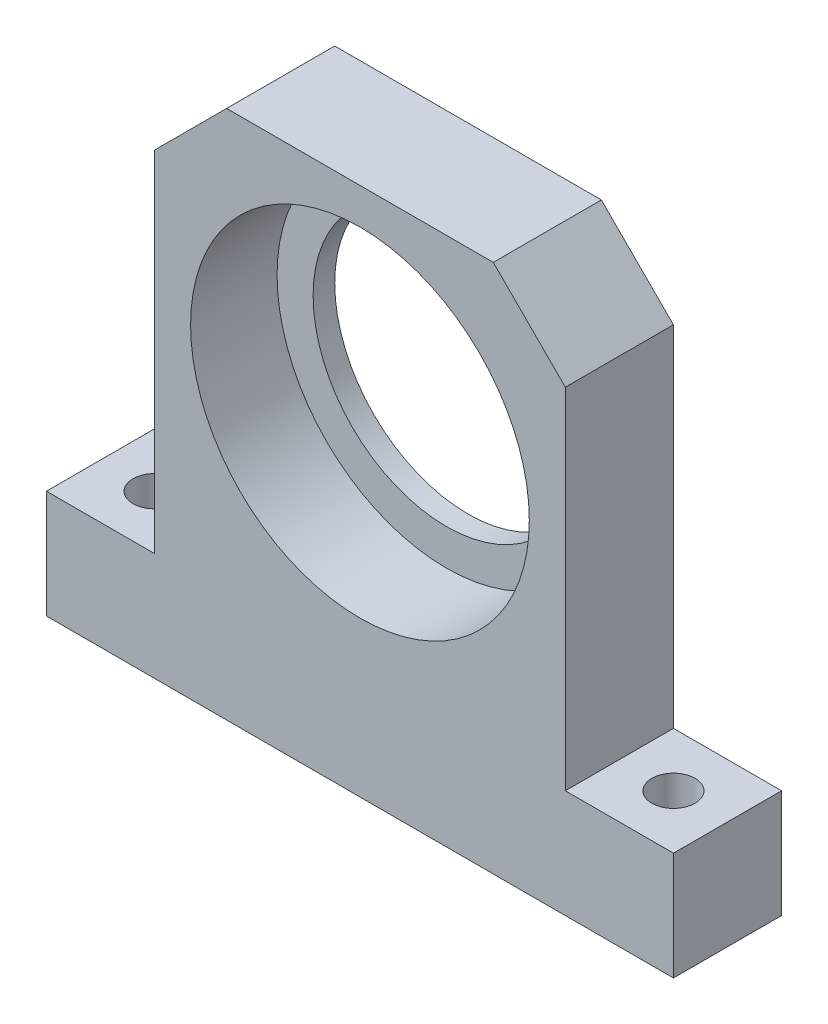
ISO-10303-21;
HEADER;
FILE_DESCRIPTION(('STEP AP214'),'2;1');
FILE_NAME('part.step','',(''),(''),'','','');
FILE_SCHEMA(('AUTOMOTIVE_DESIGN { 1 0 10303 214 1 1 1 1 }'));
ENDSEC;
DATA;
#1=APPLICATION_CONTEXT('core data for automotive mechanical design processes');
#2=APPLICATION_PROTOCOL_DEFINITION('international standard','automotive_design',2000,#1);
#3=PRODUCT_CONTEXT('',#1,'mechanical');
#4=PRODUCT('Part','Part','',(#3));
#5=PRODUCT_RELATED_PRODUCT_CATEGORY('part','',(#4));
#6=PRODUCT_DEFINITION_FORMATION('','',#4);
#7=PRODUCT_DEFINITION_CONTEXT('part definition',#1,'design');
#8=PRODUCT_DEFINITION('design','',#6,#7);
#9=PRODUCT_DEFINITION_SHAPE('','',#8);
#10=(LENGTH_UNIT() NAMED_UNIT(*) SI_UNIT(.MILLI.,.METRE.));
#11=(NAMED_UNIT(*) PLANE_ANGLE_UNIT() SI_UNIT($,.RADIAN.));
#12=(NAMED_UNIT(*) SI_UNIT($,.STERADIAN.) SOLID_ANGLE_UNIT());
#13=UNCERTAINTY_MEASURE_WITH_UNIT(LENGTH_MEASURE(1.E-05),#10,'distance_accuracy_value','');
#14=(GEOMETRIC_REPRESENTATION_CONTEXT(3) GLOBAL_UNCERTAINTY_ASSIGNED_CONTEXT((#13)) GLOBAL_UNIT_ASSIGNED_CONTEXT((#10,
#11,#12)) REPRESENTATION_CONTEXT('',''));
#15=CARTESIAN_POINT('',(0.,0.,0.));
#16=DIRECTION('',(0.,0.,1.));
#17=DIRECTION('',(1.,0.,0.));
#18=AXIS2_PLACEMENT_3D('',#15,#16,#17);
#19=CARTESIAN_POINT('',(0.,-45.,15.));
#20=DIRECTION('',(0.,1.,0.));
#21=DIRECTION('',(0.,0.,1.));
#22=AXIS2_PLACEMENT_3D('',#19,#20,#21);
#23=PLANE('',#22);
#24=CARTESIAN_POINT('',(-36.,-45.,7.5));
#25=DIRECTION('',(0.,1.,0.));
#26=DIRECTION('',(-1.,0.,0.));
#27=AXIS2_PLACEMENT_3D('',#24,#25,#26);
#28=CIRCLE('',#27,3.);
#29=CARTESIAN_POINT('',(-39.,-45.,7.5));
#30=VERTEX_POINT('',#29);
#31=EDGE_CURVE('E268',#30,#30,#28,.T.);
#32=ORIENTED_EDGE('',*,*,#31,.T.);
#33=EDGE_LOOP('',(#32));
#34=FACE_BOUND('',#33,.T.);
#35=DIRECTION('',(1.,0.,0.));
#36=VECTOR('',#35,1.);
#37=CARTESIAN_POINT('',(0.,-45.,0.));
#38=LINE('',#37,#36);
#39=CARTESIAN_POINT('',(-43.5,-45.,0.));
#40=VERTEX_POINT('',#39);
#41=CARTESIAN_POINT('',(43.5,-45.,0.));
#42=VERTEX_POINT('',#41);
#43=EDGE_CURVE('E136',#40,#42,#38,.T.);
#44=ORIENTED_EDGE('',*,*,#43,.T.);
#45=DIRECTION('',(0.,0.,-1.));
#46=VECTOR('',#45,1.);
#47=CARTESIAN_POINT('',(43.5,-45.,15.));
#48=LINE('',#47,#46);
#49=CARTESIAN_POINT('',(43.5,-45.,15.));
#50=VERTEX_POINT('',#49);
#51=EDGE_CURVE('E133',#50,#42,#48,.T.);
#52=ORIENTED_EDGE('',*,*,#51,.F.);
#53=DIRECTION('',(1.,0.,0.));
#54=VECTOR('',#53,1.);
#55=CARTESIAN_POINT('',(0.,-45.,15.));
#56=LINE('',#55,#54);
#57=CARTESIAN_POINT('',(-43.5,-45.,15.));
#58=VERTEX_POINT('',#57);
#59=EDGE_CURVE('E122',#58,#50,#56,.T.);
#60=ORIENTED_EDGE('',*,*,#59,.F.);
#61=DIRECTION('',(0.,0.,-1.));
#62=VECTOR('',#61,1.);
#63=CARTESIAN_POINT('',(-43.5,-45.,15.));
#64=LINE('',#63,#62);
#65=EDGE_CURVE('E137',#58,#40,#64,.T.);
#66=ORIENTED_EDGE('',*,*,#65,.T.);
#67=EDGE_LOOP('',(#44,#52,#60,#66));
#68=FACE_BOUND('',#67,.T.);
#69=CARTESIAN_POINT('',(36.,-45.,7.5));
#70=DIRECTION('',(0.,-1.,0.));
#71=DIRECTION('',(1.,0.,0.));
#72=AXIS2_PLACEMENT_3D('',#69,#70,#71);
#73=CIRCLE('',#72,3.);
#74=CARTESIAN_POINT('',(33.,-45.,7.5));
#75=VERTEX_POINT('',#74);
#76=EDGE_CURVE('E274',#75,#75,#73,.T.);
#77=ORIENTED_EDGE('',*,*,#76,.F.);
#78=EDGE_LOOP('',(#77));
#79=FACE_BOUND('',#78,.T.);
#80=ADVANCED_FACE('F36',(#34,#68,#79),#23,.F.);
#81=CARTESIAN_POINT('',(0.,-30.,15.));
#82=DIRECTION('',(0.,-1.,0.));
#83=DIRECTION('',(1.,0.,0.));
#84=AXIS2_PLACEMENT_3D('',#81,#82,#83);
#85=PLANE('',#84);
#86=DIRECTION('',(-1.,0.,0.));
#87=VECTOR('',#86,1.);
#88=CARTESIAN_POINT('',(0.,-30.,0.));
#89=LINE('',#88,#87);
#90=CARTESIAN_POINT('',(43.5,-30.,0.));
#91=VERTEX_POINT('',#90);
#92=CARTESIAN_POINT('',(28.5,-30.,0.));
#93=VERTEX_POINT('',#92);
#94=EDGE_CURVE('E94',#91,#93,#89,.T.);
#95=ORIENTED_EDGE('',*,*,#94,.T.);
#96=DIRECTION('',(0.,0.,-1.));
#97=VECTOR('',#96,1.);
#98=CARTESIAN_POINT('',(28.5,-30.,15.));
#99=LINE('',#98,#97);
#100=CARTESIAN_POINT('',(28.5,-30.,15.));
#101=VERTEX_POINT('',#100);
#102=EDGE_CURVE('E142',#101,#93,#99,.T.);
#103=ORIENTED_EDGE('',*,*,#102,.F.);
#104=DIRECTION('',(-1.,0.,0.));
#105=VECTOR('',#104,1.);
#106=CARTESIAN_POINT('',(0.,-30.,15.));
#107=LINE('',#106,#105);
#108=CARTESIAN_POINT('',(43.5,-30.,15.));
#109=VERTEX_POINT('',#108);
#110=EDGE_CURVE('E53',#109,#101,#107,.T.);
#111=ORIENTED_EDGE('',*,*,#110,.F.);
#112=DIRECTION('',(0.,0.,-1.));
#113=VECTOR('',#112,1.);
#114=CARTESIAN_POINT('',(43.5,-30.,15.));
#115=LINE('',#114,#113);
#116=EDGE_CURVE('E138',#109,#91,#115,.T.);
#117=ORIENTED_EDGE('',*,*,#116,.T.);
#118=EDGE_LOOP('',(#95,#103,#111,#117));
#119=FACE_BOUND('',#118,.T.);
#120=CARTESIAN_POINT('',(36.,-30.,7.5));
#121=DIRECTION('',(0.,-1.,0.));
#122=DIRECTION('',(1.,0.,0.));
#123=AXIS2_PLACEMENT_3D('',#120,#121,#122);
#124=CIRCLE('',#123,3.);
#125=CARTESIAN_POINT('',(33.,-30.,7.5));
#126=VERTEX_POINT('',#125);
#127=EDGE_CURVE('E276',#126,#126,#124,.T.);
#128=ORIENTED_EDGE('',*,*,#127,.T.);
#129=EDGE_LOOP('',(#128));
#130=FACE_BOUND('',#129,.T.);
#131=ADVANCED_FACE('F234',(#119,#130),#85,.F.);
#132=CARTESIAN_POINT('',(28.5,0.,15.));
#133=DIRECTION('',(-1.,0.,0.));
#134=DIRECTION('',(0.,0.,1.));
#135=AXIS2_PLACEMENT_3D('',#132,#133,#134);
#136=PLANE('',#135);
#137=DIRECTION('',(0.,1.,0.));
#138=VECTOR('',#137,1.);
#139=CARTESIAN_POINT('',(28.5,0.,0.));
#140=LINE('',#139,#138);
#141=CARTESIAN_POINT('',(28.5,18.5,0.));
#142=VERTEX_POINT('',#141);
#143=EDGE_CURVE('E146',#93,#142,#140,.T.);
#144=ORIENTED_EDGE('',*,*,#143,.T.);
#145=DIRECTION('',(0.,0.,-1.));
#146=VECTOR('',#145,1.);
#147=CARTESIAN_POINT('',(28.5,18.5,15.));
#148=LINE('',#147,#146);
#149=CARTESIAN_POINT('',(28.5,18.5,15.));
#150=VERTEX_POINT('',#149);
#151=EDGE_CURVE('E45',#150,#142,#148,.T.);
#152=ORIENTED_EDGE('',*,*,#151,.F.);
#153=DIRECTION('',(0.,1.,0.));
#154=VECTOR('',#153,1.);
#155=CARTESIAN_POINT('',(28.5,0.,15.));
#156=LINE('',#155,#154);
#157=EDGE_CURVE('E261',#101,#150,#156,.T.);
#158=ORIENTED_EDGE('',*,*,#157,.F.);
#159=ORIENTED_EDGE('',*,*,#102,.T.);
#160=EDGE_LOOP('',(#144,#152,#158,#159));
#161=FACE_BOUND('',#160,.T.);
#162=ADVANCED_FACE('F188',(#161),#136,.F.);
#163=CARTESIAN_POINT('',(23.5,23.5,15.));
#164=DIRECTION('',(-0.707106781186547,-0.707106781186548,0.));
#165=DIRECTION('',(0.707106781186548,-0.707106781186547,0.));
#166=AXIS2_PLACEMENT_3D('',#163,#164,#165);
#167=PLANE('',#166);
#168=DIRECTION('',(-0.707106781186548,0.707106781186547,0.));
#169=VECTOR('',#168,1.);
#170=CARTESIAN_POINT('',(23.5,23.5,0.));
#171=LINE('',#170,#169);
#172=CARTESIAN_POINT('',(18.5,28.5,0.));
#173=VERTEX_POINT('',#172);
#174=EDGE_CURVE('E149',#142,#173,#171,.T.);
#175=ORIENTED_EDGE('',*,*,#174,.T.);
#176=DIRECTION('',(0.,0.,-1.));
#177=VECTOR('',#176,1.);
#178=CARTESIAN_POINT('',(18.5,28.5,15.));
#179=LINE('',#178,#177);
#180=CARTESIAN_POINT('',(18.5,28.5,15.));
#181=VERTEX_POINT('',#180);
#182=EDGE_CURVE('E181',#181,#173,#179,.T.);
#183=ORIENTED_EDGE('',*,*,#182,.F.);
#184=DIRECTION('',(-0.707106781186548,0.707106781186547,0.));
#185=VECTOR('',#184,1.);
#186=CARTESIAN_POINT('',(23.5,23.5,15.));
#187=LINE('',#186,#185);
#188=EDGE_CURVE('E103',#150,#181,#187,.T.);
#189=ORIENTED_EDGE('',*,*,#188,.F.);
#190=ORIENTED_EDGE('',*,*,#151,.T.);
#191=EDGE_LOOP('',(#175,#183,#189,#190));
#192=FACE_BOUND('',#191,.T.);
#193=ADVANCED_FACE('F184',(#192),#167,.F.);
#194=CARTESIAN_POINT('',(0.,28.5,15.));
#195=DIRECTION('',(0.,-1.,0.));
#196=DIRECTION('',(1.,0.,0.));
#197=AXIS2_PLACEMENT_3D('',#194,#195,#196);
#198=PLANE('',#197);
#199=DIRECTION('',(-1.,0.,0.));
#200=VECTOR('',#199,1.);
#201=CARTESIAN_POINT('',(0.,28.5,0.));
#202=LINE('',#201,#200);
#203=CARTESIAN_POINT('',(-18.5,28.5,0.));
#204=VERTEX_POINT('',#203);
#205=EDGE_CURVE('E152',#173,#204,#202,.T.);
#206=ORIENTED_EDGE('',*,*,#205,.T.);
#207=DIRECTION('',(0.,0.,-1.));
#208=VECTOR('',#207,1.);
#209=CARTESIAN_POINT('',(-18.5,28.5,15.));
#210=LINE('',#209,#208);
#211=CARTESIAN_POINT('',(-18.5,28.5,15.));
#212=VERTEX_POINT('',#211);
#213=EDGE_CURVE('E178',#212,#204,#210,.T.);
#214=ORIENTED_EDGE('',*,*,#213,.F.);
#215=DIRECTION('',(-1.,0.,0.));
#216=VECTOR('',#215,1.);
#217=CARTESIAN_POINT('',(0.,28.5,15.));
#218=LINE('',#217,#216);
#219=EDGE_CURVE('E206',#181,#212,#218,.T.);
#220=ORIENTED_EDGE('',*,*,#219,.F.);
#221=ORIENTED_EDGE('',*,*,#182,.T.);
#222=EDGE_LOOP('',(#206,#214,#220,#221));
#223=FACE_BOUND('',#222,.T.);
#224=ADVANCED_FACE('F197',(#223),#198,.F.);
#225=CARTESIAN_POINT('',(-23.5,23.5,15.));
#226=DIRECTION('',(0.707106781186547,-0.707106781186548,0.));
#227=DIRECTION('',(0.707106781186548,0.707106781186547,0.));
#228=AXIS2_PLACEMENT_3D('',#225,#226,#227);
#229=PLANE('',#228);
#230=DIRECTION('',(-0.707106781186548,-0.707106781186547,0.));
#231=VECTOR('',#230,1.);
#232=CARTESIAN_POINT('',(-23.5,23.5,0.));
#233=LINE('',#232,#231);
#234=CARTESIAN_POINT('',(-28.5,18.5,0.));
#235=VERTEX_POINT('',#234);
#236=EDGE_CURVE('E154',#204,#235,#233,.T.);
#237=ORIENTED_EDGE('',*,*,#236,.T.);
#238=DIRECTION('',(0.,0.,-1.));
#239=VECTOR('',#238,1.);
#240=CARTESIAN_POINT('',(-28.5,18.5,15.));
#241=LINE('',#240,#239);
#242=CARTESIAN_POINT('',(-28.5,18.5,15.));
#243=VERTEX_POINT('',#242);
#244=EDGE_CURVE('E175',#243,#235,#241,.T.);
#245=ORIENTED_EDGE('',*,*,#244,.F.);
#246=DIRECTION('',(-0.707106781186548,-0.707106781186547,0.));
#247=VECTOR('',#246,1.);
#248=CARTESIAN_POINT('',(-23.5,23.5,15.));
#249=LINE('',#248,#247);
#250=EDGE_CURVE('E203',#212,#243,#249,.T.);
#251=ORIENTED_EDGE('',*,*,#250,.F.);
#252=ORIENTED_EDGE('',*,*,#213,.T.);
#253=EDGE_LOOP('',(#237,#245,#251,#252));
#254=FACE_BOUND('',#253,.T.);
#255=ADVANCED_FACE('F201',(#254),#229,.F.);
#256=CARTESIAN_POINT('',(-28.5,0.,15.));
#257=DIRECTION('',(1.,0.,0.));
#258=DIRECTION('',(0.,1.,0.));
#259=AXIS2_PLACEMENT_3D('',#256,#257,#258);
#260=PLANE('',#259);
#261=DIRECTION('',(0.,-1.,0.));
#262=VECTOR('',#261,1.);
#263=CARTESIAN_POINT('',(-28.5,0.,0.));
#264=LINE('',#263,#262);
#265=CARTESIAN_POINT('',(-28.5,-30.,0.));
#266=VERTEX_POINT('',#265);
#267=EDGE_CURVE('E156',#235,#266,#264,.T.);
#268=ORIENTED_EDGE('',*,*,#267,.T.);
#269=DIRECTION('',(0.,0.,-1.));
#270=VECTOR('',#269,1.);
#271=CARTESIAN_POINT('',(-28.5,-30.,15.));
#272=LINE('',#271,#270);
#273=CARTESIAN_POINT('',(-28.5,-30.,15.));
#274=VERTEX_POINT('',#273);
#275=EDGE_CURVE('E172',#274,#266,#272,.T.);
#276=ORIENTED_EDGE('',*,*,#275,.F.);
#277=DIRECTION('',(0.,-1.,0.));
#278=VECTOR('',#277,1.);
#279=CARTESIAN_POINT('',(-28.5,0.,15.));
#280=LINE('',#279,#278);
#281=EDGE_CURVE('E205',#243,#274,#280,.T.);
#282=ORIENTED_EDGE('',*,*,#281,.F.);
#283=ORIENTED_EDGE('',*,*,#244,.T.);
#284=EDGE_LOOP('',(#268,#276,#282,#283));
#285=FACE_BOUND('',#284,.T.);
#286=ADVANCED_FACE('F223',(#285),#260,.F.);
#287=CARTESIAN_POINT('',(0.,-30.,15.));
#288=DIRECTION('',(0.,-1.,0.));
#289=DIRECTION('',(1.,0.,0.));
#290=AXIS2_PLACEMENT_3D('',#287,#288,#289);
#291=PLANE('',#290);
#292=CARTESIAN_POINT('',(-36.,-30.,7.5));
#293=DIRECTION('',(0.,1.,0.));
#294=DIRECTION('',(-1.,0.,0.));
#295=AXIS2_PLACEMENT_3D('',#292,#293,#294);
#296=CIRCLE('',#295,3.);
#297=CARTESIAN_POINT('',(-39.,-30.,7.5));
#298=VERTEX_POINT('',#297);
#299=EDGE_CURVE('E271',#298,#298,#296,.T.);
#300=ORIENTED_EDGE('',*,*,#299,.F.);
#301=EDGE_LOOP('',(#300));
#302=FACE_BOUND('',#301,.T.);
#303=DIRECTION('',(-1.,0.,0.));
#304=VECTOR('',#303,1.);
#305=CARTESIAN_POINT('',(0.,-30.,0.));
#306=LINE('',#305,#304);
#307=CARTESIAN_POINT('',(-43.5,-30.,0.));
#308=VERTEX_POINT('',#307);
#309=EDGE_CURVE('E158',#266,#308,#306,.T.);
#310=ORIENTED_EDGE('',*,*,#309,.T.);
#311=DIRECTION('',(0.,0.,-1.));
#312=VECTOR('',#311,1.);
#313=CARTESIAN_POINT('',(-43.5,-30.,15.));
#314=LINE('',#313,#312);
#315=CARTESIAN_POINT('',(-43.5,-30.,15.));
#316=VERTEX_POINT('',#315);
#317=EDGE_CURVE('E169',#316,#308,#314,.T.);
#318=ORIENTED_EDGE('',*,*,#317,.F.);
#319=DIRECTION('',(-1.,0.,0.));
#320=VECTOR('',#319,1.);
#321=CARTESIAN_POINT('',(0.,-30.,15.));
#322=LINE('',#321,#320);
#323=EDGE_CURVE('E208',#274,#316,#322,.T.);
#324=ORIENTED_EDGE('',*,*,#323,.F.);
#325=ORIENTED_EDGE('',*,*,#275,.T.);
#326=EDGE_LOOP('',(#310,#318,#324,#325));
#327=FACE_BOUND('',#326,.T.);
#328=ADVANCED_FACE('F217',(#302,#327),#291,.F.);
#329=CARTESIAN_POINT('',(-43.5,0.,15.));
#330=DIRECTION('',(1.,0.,0.));
#331=DIRECTION('',(0.,0.,-1.));
#332=AXIS2_PLACEMENT_3D('',#329,#330,#331);
#333=PLANE('',#332);
#334=DIRECTION('',(0.,-1.,0.));
#335=VECTOR('',#334,1.);
#336=CARTESIAN_POINT('',(-43.5,0.,0.));
#337=LINE('',#336,#335);
#338=EDGE_CURVE('E160',#308,#40,#337,.T.);
#339=ORIENTED_EDGE('',*,*,#338,.T.);
#340=ORIENTED_EDGE('',*,*,#65,.F.);
#341=DIRECTION('',(0.,-1.,0.));
#342=VECTOR('',#341,1.);
#343=CARTESIAN_POINT('',(-43.5,0.,15.));
#344=LINE('',#343,#342);
#345=EDGE_CURVE('E128',#316,#58,#344,.T.);
#346=ORIENTED_EDGE('',*,*,#345,.F.);
#347=ORIENTED_EDGE('',*,*,#317,.T.);
#348=EDGE_LOOP('',(#339,#340,#346,#347));
#349=FACE_BOUND('',#348,.T.);
#350=ADVANCED_FACE('F221',(#349),#333,.F.);
#351=CARTESIAN_POINT('',(43.5,0.,15.));
#352=DIRECTION('',(-1.,0.,0.));
#353=DIRECTION('',(0.,0.,1.));
#354=AXIS2_PLACEMENT_3D('',#351,#352,#353);
#355=PLANE('',#354);
#356=DIRECTION('',(0.,1.,0.));
#357=VECTOR('',#356,1.);
#358=CARTESIAN_POINT('',(43.5,0.,0.));
#359=LINE('',#358,#357);
#360=EDGE_CURVE('E88',#42,#91,#359,.T.);
#361=ORIENTED_EDGE('',*,*,#360,.T.);
#362=ORIENTED_EDGE('',*,*,#116,.F.);
#363=DIRECTION('',(0.,1.,0.));
#364=VECTOR('',#363,1.);
#365=CARTESIAN_POINT('',(43.5,0.,15.));
#366=LINE('',#365,#364);
#367=EDGE_CURVE('E126',#50,#109,#366,.T.);
#368=ORIENTED_EDGE('',*,*,#367,.F.);
#369=ORIENTED_EDGE('',*,*,#51,.T.);
#370=EDGE_LOOP('',(#361,#362,#368,#369));
#371=FACE_BOUND('',#370,.T.);
#372=ADVANCED_FACE('F140',(#371),#355,.F.);
#373=CARTESIAN_POINT('',(0.,0.,15.));
#374=DIRECTION('',(0.,0.,-1.));
#375=DIRECTION('',(-1.,0.,0.));
#376=AXIS2_PLACEMENT_3D('',#373,#374,#375);
#377=CYLINDRICAL_SURFACE('',#376,23.5);
#378=CARTESIAN_POINT('',(0.,0.,3.));
#379=DIRECTION('',(0.,0.,1.));
#380=DIRECTION('',(1.,0.,0.));
#381=AXIS2_PLACEMENT_3D('',#378,#379,#380);
#382=CIRCLE('',#381,23.5);
#383=CARTESIAN_POINT('',(23.5,0.,3.));
#384=VERTEX_POINT('',#383);
#385=EDGE_CURVE('E11',#384,#384,#382,.T.);
#386=ORIENTED_EDGE('',*,*,#385,.F.);
#387=EDGE_LOOP('',(#386));
#388=FACE_BOUND('',#387,.T.);
#389=CARTESIAN_POINT('',(0.,0.,15.));
#390=DIRECTION('',(0.,0.,1.));
#391=DIRECTION('',(1.,0.,0.));
#392=AXIS2_PLACEMENT_3D('',#389,#390,#391);
#393=CIRCLE('',#392,23.5);
#394=CARTESIAN_POINT('',(23.5,0.,15.));
#395=VERTEX_POINT('',#394);
#396=EDGE_CURVE('E165',#395,#395,#393,.T.);
#397=ORIENTED_EDGE('',*,*,#396,.T.);
#398=EDGE_LOOP('',(#397));
#399=FACE_BOUND('',#398,.T.);
#400=ADVANCED_FACE('F38',(#388,#399),#377,.F.);
#401=CARTESIAN_POINT('',(0.,0.,15.));
#402=DIRECTION('',(0.,0.,1.));
#403=DIRECTION('',(1.,0.,0.));
#404=AXIS2_PLACEMENT_3D('',#401,#402,#403);
#405=PLANE('',#404);
#406=ORIENTED_EDGE('',*,*,#396,.F.);
#407=EDGE_LOOP('',(#406));
#408=FACE_BOUND('',#407,.T.);
#409=ORIENTED_EDGE('',*,*,#157,.T.);
#410=ORIENTED_EDGE('',*,*,#188,.T.);
#411=ORIENTED_EDGE('',*,*,#219,.T.);
#412=ORIENTED_EDGE('',*,*,#250,.T.);
#413=ORIENTED_EDGE('',*,*,#281,.T.);
#414=ORIENTED_EDGE('',*,*,#323,.T.);
#415=ORIENTED_EDGE('',*,*,#345,.T.);
#416=ORIENTED_EDGE('',*,*,#59,.T.);
#417=ORIENTED_EDGE('',*,*,#367,.T.);
#418=ORIENTED_EDGE('',*,*,#110,.T.);
#419=EDGE_LOOP('',(#409,#410,#411,#412,#413,#414,#415,#416,#417,#418));
#420=FACE_BOUND('',#419,.T.);
#421=ADVANCED_FACE('F124',(#408,#420),#405,.T.);
#422=CARTESIAN_POINT('',(0.,0.,0.));
#423=DIRECTION('',(0.,0.,1.));
#424=DIRECTION('',(1.,0.,0.));
#425=AXIS2_PLACEMENT_3D('',#422,#423,#424);
#426=PLANE('',#425);
#427=ORIENTED_EDGE('',*,*,#143,.F.);
#428=ORIENTED_EDGE('',*,*,#94,.F.);
#429=ORIENTED_EDGE('',*,*,#360,.F.);
#430=ORIENTED_EDGE('',*,*,#43,.F.);
#431=ORIENTED_EDGE('',*,*,#338,.F.);
#432=ORIENTED_EDGE('',*,*,#309,.F.);
#433=ORIENTED_EDGE('',*,*,#267,.F.);
#434=ORIENTED_EDGE('',*,*,#236,.F.);
#435=ORIENTED_EDGE('',*,*,#205,.F.);
#436=ORIENTED_EDGE('',*,*,#174,.F.);
#437=EDGE_LOOP('',(#427,#428,#429,#430,#431,#432,#433,#434,#435,#436));
#438=FACE_BOUND('',#437,.T.);
#439=CARTESIAN_POINT('',(0.,0.,0.));
#440=DIRECTION('',(0.,0.,1.));
#441=DIRECTION('',(1.,0.,0.));
#442=AXIS2_PLACEMENT_3D('',#439,#440,#441);
#443=CIRCLE('',#442,18.5);
#444=CARTESIAN_POINT('',(18.5,0.,0.));
#445=VERTEX_POINT('',#444);
#446=EDGE_CURVE('E265',#445,#445,#443,.T.);
#447=ORIENTED_EDGE('',*,*,#446,.T.);
#448=EDGE_LOOP('',(#447));
#449=FACE_BOUND('',#448,.T.);
#450=ADVANCED_FACE('F190',(#438,#449),#426,.F.);
#451=CARTESIAN_POINT('',(0.,0.,3.));
#452=DIRECTION('',(0.,0.,-1.));
#453=DIRECTION('',(-1.,0.,0.));
#454=AXIS2_PLACEMENT_3D('',#451,#452,#453);
#455=CYLINDRICAL_SURFACE('',#454,18.5);
#456=CARTESIAN_POINT('',(0.,0.,3.));
#457=DIRECTION('',(0.,0.,1.));
#458=DIRECTION('',(1.,0.,0.));
#459=AXIS2_PLACEMENT_3D('',#456,#457,#458);
#460=CIRCLE('',#459,18.5);
#461=CARTESIAN_POINT('',(18.5,0.,3.));
#462=VERTEX_POINT('',#461);
#463=EDGE_CURVE('E150',#462,#462,#460,.T.);
#464=ORIENTED_EDGE('',*,*,#463,.T.);
#465=EDGE_LOOP('',(#464));
#466=FACE_BOUND('',#465,.T.);
#467=ORIENTED_EDGE('',*,*,#446,.F.);
#468=EDGE_LOOP('',(#467));
#469=FACE_BOUND('',#468,.T.);
#470=ADVANCED_FACE('F298',(#466,#469),#455,.F.);
#471=CARTESIAN_POINT('',(0.,0.,3.));
#472=DIRECTION('',(0.,0.,1.));
#473=DIRECTION('',(1.,0.,0.));
#474=AXIS2_PLACEMENT_3D('',#471,#472,#473);
#475=PLANE('',#474);
#476=ORIENTED_EDGE('',*,*,#463,.F.);
#477=EDGE_LOOP('',(#476));
#478=FACE_BOUND('',#477,.T.);
#479=ORIENTED_EDGE('',*,*,#385,.T.);
#480=EDGE_LOOP('',(#479));
#481=FACE_BOUND('',#480,.T.);
#482=ADVANCED_FACE('F292',(#478,#481),#475,.T.);
#483=CARTESIAN_POINT('',(-36.,-45.,7.5));
#484=DIRECTION('',(0.,1.,0.));
#485=DIRECTION('',(-1.,0.,0.));
#486=AXIS2_PLACEMENT_3D('',#483,#484,#485);
#487=CYLINDRICAL_SURFACE('',#486,3.);
#488=ORIENTED_EDGE('',*,*,#31,.F.);
#489=EDGE_LOOP('',(#488));
#490=FACE_BOUND('',#489,.T.);
#491=ORIENTED_EDGE('',*,*,#299,.T.);
#492=EDGE_LOOP('',(#491));
#493=FACE_BOUND('',#492,.T.);
#494=ADVANCED_FACE('F285',(#490,#493),#487,.F.);
#495=CARTESIAN_POINT('',(36.,-45.,7.5));
#496=DIRECTION('',(0.,1.,0.));
#497=DIRECTION('',(-1.,0.,0.));
#498=AXIS2_PLACEMENT_3D('',#495,#496,#497);
#499=CYLINDRICAL_SURFACE('',#498,3.);
#500=CARTESIAN_POINT('',(33.,-45.,7.5));
#501=CARTESIAN_POINT('',(33.,-44.84375,7.5));
#502=CARTESIAN_POINT('',(33.,-44.6875,7.5));
#503=CARTESIAN_POINT('',(33.,-44.375,7.5));
#504=CARTESIAN_POINT('',(33.,-44.21875,7.5));
#505=CARTESIAN_POINT('',(33.,-43.90625,7.5));
#506=CARTESIAN_POINT('',(33.,-43.75,7.5));
#507=CARTESIAN_POINT('',(33.,-43.4375,7.5));
#508=CARTESIAN_POINT('',(33.,-43.28125,7.5));
#509=CARTESIAN_POINT('',(33.,-42.96875,7.5));
#510=CARTESIAN_POINT('',(33.,-42.8125,7.5));
#511=CARTESIAN_POINT('',(33.,-42.5,7.5));
#512=CARTESIAN_POINT('',(33.,-42.34375,7.5));
#513=CARTESIAN_POINT('',(33.,-42.03125,7.5));
#514=CARTESIAN_POINT('',(33.,-41.875,7.5));
#515=CARTESIAN_POINT('',(33.,-41.5625,7.5));
#516=CARTESIAN_POINT('',(33.,-41.40625,7.5));
#517=CARTESIAN_POINT('',(33.,-41.09375,7.5));
#518=CARTESIAN_POINT('',(33.,-40.9375,7.5));
#519=CARTESIAN_POINT('',(33.,-40.625,7.5));
#520=CARTESIAN_POINT('',(33.,-40.46875,7.5));
#521=CARTESIAN_POINT('',(33.,-40.15625,7.5));
#522=CARTESIAN_POINT('',(33.,-40.,7.5));
#523=CARTESIAN_POINT('',(33.,-39.6875,7.5));
#524=CARTESIAN_POINT('',(33.,-39.53125,7.5));
#525=CARTESIAN_POINT('',(33.,-39.21875,7.5));
#526=CARTESIAN_POINT('',(33.,-39.0625,7.5));
#527=CARTESIAN_POINT('',(33.,-38.75,7.5));
#528=CARTESIAN_POINT('',(33.,-38.59375,7.5));
#529=CARTESIAN_POINT('',(33.,-38.28125,7.5));
#530=CARTESIAN_POINT('',(33.,-38.125,7.5));
#531=CARTESIAN_POINT('',(33.,-37.8125,7.5));
#532=CARTESIAN_POINT('',(33.,-37.65625,7.5));
#533=CARTESIAN_POINT('',(33.,-37.34375,7.5));
#534=CARTESIAN_POINT('',(33.,-37.1875,7.5));
#535=CARTESIAN_POINT('',(33.,-36.875,7.5));
#536=CARTESIAN_POINT('',(33.,-36.71875,7.5));
#537=CARTESIAN_POINT('',(33.,-36.40625,7.5));
#538=CARTESIAN_POINT('',(33.,-36.25,7.5));
#539=CARTESIAN_POINT('',(33.,-35.9375,7.5));
#540=CARTESIAN_POINT('',(33.,-35.78125,7.5));
#541=CARTESIAN_POINT('',(33.,-35.46875,7.5));
#542=CARTESIAN_POINT('',(33.,-35.3125,7.5));
#543=CARTESIAN_POINT('',(33.,-35.,7.5));
#544=CARTESIAN_POINT('',(33.,-34.84375,7.5));
#545=CARTESIAN_POINT('',(33.,-34.53125,7.5));
#546=CARTESIAN_POINT('',(33.,-34.375,7.5));
#547=CARTESIAN_POINT('',(33.,-34.0625,7.5));
#548=CARTESIAN_POINT('',(33.,-33.90625,7.5));
#549=CARTESIAN_POINT('',(33.,-33.59375,7.5));
#550=CARTESIAN_POINT('',(33.,-33.4375,7.5));
#551=CARTESIAN_POINT('',(33.,-33.125,7.5));
#552=CARTESIAN_POINT('',(33.,-32.96875,7.5));
#553=CARTESIAN_POINT('',(33.,-32.65625,7.5));
#554=CARTESIAN_POINT('',(33.,-32.5,7.5));
#555=CARTESIAN_POINT('',(33.,-32.1875,7.5));
#556=CARTESIAN_POINT('',(33.,-32.03125,7.5));
#557=CARTESIAN_POINT('',(33.,-31.71875,7.5));
#558=CARTESIAN_POINT('',(33.,-31.5625,7.5));
#559=CARTESIAN_POINT('',(33.,-31.25,7.5));
#560=CARTESIAN_POINT('',(33.,-31.09375,7.5));
#561=CARTESIAN_POINT('',(33.,-30.78125,7.5));
#562=CARTESIAN_POINT('',(33.,-30.625,7.5));
#563=CARTESIAN_POINT('',(33.,-30.3125,7.5));
#564=CARTESIAN_POINT('',(33.,-30.15625,7.5));
#565=CARTESIAN_POINT('',(33.,-30.,7.5));
#566=B_SPLINE_CURVE_WITH_KNOTS('',3,(#500,#501,#502,#503,#504,#505,#506,#507,#508,#509,#510,
#511,#512,#513,#514,#515,#516,#517,#518,#519,#520,#521,#522,#523,#524,#525,#526,#527,#528,#529,
#530,#531,#532,#533,#534,#535,#536,#537,#538,#539,#540,#541,#542,#543,#544,#545,#546,#547,#548,
#549,#550,#551,#552,#553,#554,#555,#556,#557,#558,#559,#560,#561,#562,#563,#564,#565),
.UNSPECIFIED.,.F.,.F.,(4,2,2,2,2,2,2,2,2,2,2,2,2,2,2,2,2,2,2,2,2,2,2,2,2,2,2,2,2,2,2,2,4),(0.,
0.468749999999997,0.937500000000001,1.40625,1.875,2.34375000000001,2.8125,3.28125000000001,
3.75000000000001,4.21875000000001,4.68750000000001,5.15625000000001,5.62500000000001,
6.09375000000002,6.56250000000001,7.03125000000002,7.50000000000002,7.96875000000002,
8.43750000000002,8.90625000000002,9.37500000000002,9.84375000000003,10.3125,10.78125,11.25,
11.71875,12.1875,12.65625,13.125,13.59375,14.0625,14.53125,15.),.UNSPECIFIED.);
#567=EDGE_CURVE('BSEAM282',#75,#126,#566,.T.);
#568=ORIENTED_EDGE('',*,*,#76,.T.);
#569=ORIENTED_EDGE('',*,*,#127,.F.);
#570=ORIENTED_EDGE('',*,*,#567,.T.);
#571=ORIENTED_EDGE('',*,*,#567,.F.);
#572=EDGE_LOOP('',(#568,#570,#569,#571));
#573=FACE_BOUND('',#572,.T.);
#574=ADVANCED_FACE('F282',(#573),#499,.F.);
#575=CLOSED_SHELL('',(#80,#131,#162,#193,#224,#255,#286,#328,#350,#372,#400,#421,#450,#470,#482,
#494,#574));
#576=MANIFOLD_SOLID_BREP('B2',#575);
#577=ADVANCED_BREP_SHAPE_REPRESENTATION('',(#18,#576),#14);
#578=SHAPE_DEFINITION_REPRESENTATION(#9,#577);
ENDSEC;
END-ISO-10303-21;
